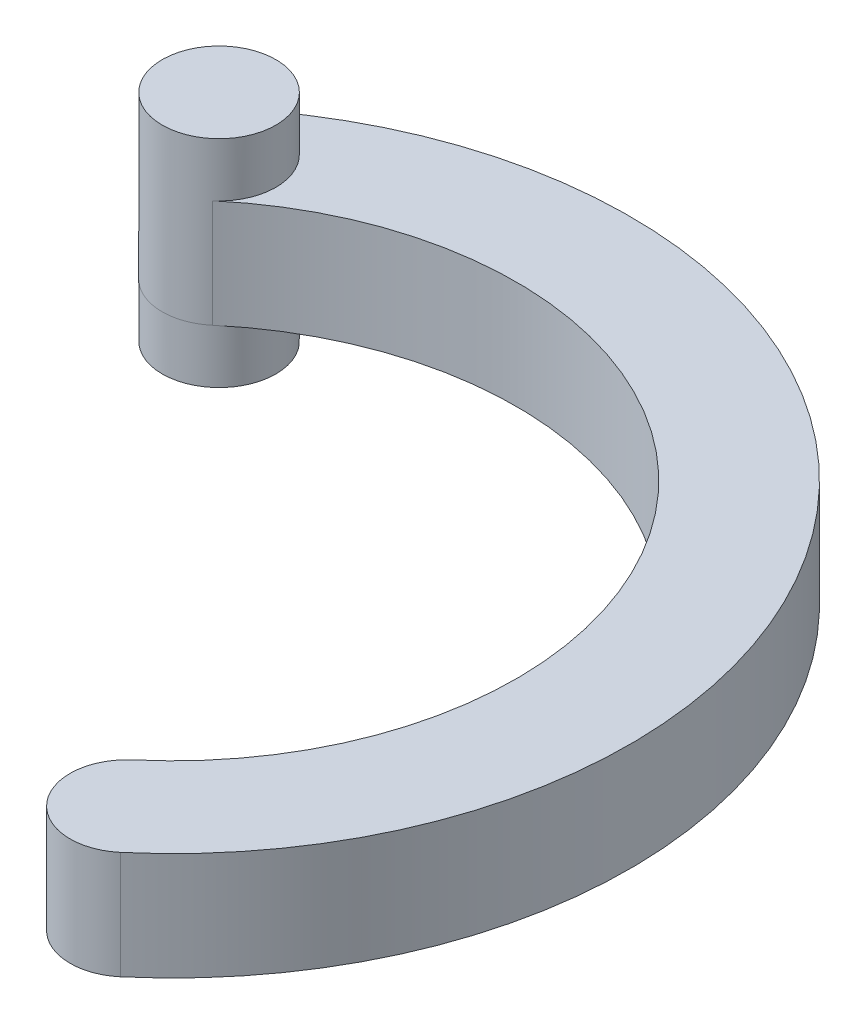
ISO-10303-21;
HEADER;
FILE_DESCRIPTION(('STEP AP214'),'2;1');
FILE_NAME('part.step','',(''),(''),'','','');
FILE_SCHEMA(('AUTOMOTIVE_DESIGN { 1 0 10303 214 1 1 1 1 }'));
ENDSEC;
DATA;
#1=APPLICATION_CONTEXT('core data for automotive mechanical design processes');
#2=APPLICATION_PROTOCOL_DEFINITION('international standard','automotive_design',2000,#1);
#3=PRODUCT_CONTEXT('',#1,'mechanical');
#4=PRODUCT('Part','Part','',(#3));
#5=PRODUCT_RELATED_PRODUCT_CATEGORY('part','',(#4));
#6=PRODUCT_DEFINITION_FORMATION('','',#4);
#7=PRODUCT_DEFINITION_CONTEXT('part definition',#1,'design');
#8=PRODUCT_DEFINITION('design','',#6,#7);
#9=PRODUCT_DEFINITION_SHAPE('','',#8);
#10=(LENGTH_UNIT() NAMED_UNIT(*) SI_UNIT(.MILLI.,.METRE.));
#11=(NAMED_UNIT(*) PLANE_ANGLE_UNIT() SI_UNIT($,.RADIAN.));
#12=(NAMED_UNIT(*) SI_UNIT($,.STERADIAN.) SOLID_ANGLE_UNIT());
#13=UNCERTAINTY_MEASURE_WITH_UNIT(LENGTH_MEASURE(1.E-05),#10,'distance_accuracy_value','');
#14=(GEOMETRIC_REPRESENTATION_CONTEXT(3) GLOBAL_UNCERTAINTY_ASSIGNED_CONTEXT((#13)) GLOBAL_UNIT_ASSIGNED_CONTEXT((#10,
#11,#12)) REPRESENTATION_CONTEXT('',''));
#15=CARTESIAN_POINT('',(0.,0.,0.));
#16=DIRECTION('',(0.,0.,1.));
#17=DIRECTION('',(1.,0.,0.));
#18=AXIS2_PLACEMENT_3D('',#15,#16,#17);
#19=CARTESIAN_POINT('',(48.0814758361402,10.,56.6320475670309));
#20=DIRECTION('',(0.,-1.,0.));
#21=DIRECTION('',(0.,0.,-1.));
#22=AXIS2_PLACEMENT_3D('',#19,#20,#21);
#23=CYLINDRICAL_SURFACE('',#22,5.27141553759391);
#24=CARTESIAN_POINT('',(48.0814758361402,0.,56.6320475670309));
#25=DIRECTION('',(0.,1.,0.));
#26=DIRECTION('',(0.,0.,1.));
#27=AXIS2_PLACEMENT_3D('',#24,#25,#26);
#28=CIRCLE('',#27,5.27141553759391);
#29=CARTESIAN_POINT('',(44.6697496335499,0.,52.6135968595386));
#30=VERTEX_POINT('',#29);
#31=CARTESIAN_POINT('',(51.4932020387305,0.,60.6504982745232));
#32=VERTEX_POINT('',#31);
#33=EDGE_CURVE('E113',#30,#32,#28,.T.);
#34=ORIENTED_EDGE('',*,*,#33,.T.);
#35=DIRECTION('',(0.,-1.,0.));
#36=VECTOR('',#35,1.);
#37=CARTESIAN_POINT('',(51.4932020387305,10.,60.6504982745232));
#38=LINE('',#37,#36);
#39=CARTESIAN_POINT('',(51.4932020387305,10.,60.6504982745232));
#40=VERTEX_POINT('',#39);
#41=EDGE_CURVE('E52',#40,#32,#38,.T.);
#42=ORIENTED_EDGE('',*,*,#41,.F.);
#43=CARTESIAN_POINT('',(48.0814758361402,10.,56.6320475670309));
#44=DIRECTION('',(0.,1.,0.));
#45=DIRECTION('',(0.,0.,1.));
#46=AXIS2_PLACEMENT_3D('',#43,#44,#45);
#47=CIRCLE('',#46,5.27141553759391);
#48=CARTESIAN_POINT('',(44.6697496335499,10.,52.6135968595386));
#49=VERTEX_POINT('',#48);
#50=EDGE_CURVE('E118',#49,#40,#47,.T.);
#51=ORIENTED_EDGE('',*,*,#50,.F.);
#52=DIRECTION('',(0.,-1.,0.));
#53=VECTOR('',#52,1.);
#54=CARTESIAN_POINT('',(44.6697496335499,10.,52.6135968595386));
#55=LINE('',#54,#53);
#56=EDGE_CURVE('E94',#49,#30,#55,.T.);
#57=ORIENTED_EDGE('',*,*,#56,.T.);
#58=EDGE_LOOP('',(#34,#42,#51,#57));
#59=FACE_BOUND('',#58,.T.);
#60=ADVANCED_FACE('F43',(#59),#23,.T.);
#61=CARTESIAN_POINT('',(24.0407379180869,10.,28.3160237835012));
#62=DIRECTION('',(0.,-1.,0.));
#63=DIRECTION('',(0.,0.,-1.));
#64=AXIS2_PLACEMENT_3D('',#61,#62,#63);
#65=CYLINDRICAL_SURFACE('',#64,42.416459386726);
#66=CARTESIAN_POINT('',(24.0407379180869,0.,28.3160237835012));
#67=DIRECTION('',(0.,1.,0.));
#68=DIRECTION('',(0.,0.,1.));
#69=AXIS2_PLACEMENT_3D('',#66,#67,#68);
#70=CIRCLE('',#69,42.416459386726);
#71=CARTESIAN_POINT('',(-3.41172620259505,0.,-4.01845070748825));
#72=VERTEX_POINT('',#71);
#73=EDGE_CURVE('E126',#32,#72,#70,.T.);
#74=ORIENTED_EDGE('',*,*,#73,.T.);
#75=DIRECTION('',(0.,-1.,0.));
#76=VECTOR('',#75,1.);
#77=CARTESIAN_POINT('',(-3.41172620259505,10.,-4.01845070748825));
#78=LINE('',#77,#76);
#79=CARTESIAN_POINT('',(-3.41172620259505,10.,-4.01845070748825));
#80=VERTEX_POINT('',#79);
#81=EDGE_CURVE('E103',#80,#72,#78,.T.);
#82=ORIENTED_EDGE('',*,*,#81,.F.);
#83=CARTESIAN_POINT('',(24.0407379180869,10.,28.3160237835012));
#84=DIRECTION('',(0.,1.,0.));
#85=DIRECTION('',(0.,0.,1.));
#86=AXIS2_PLACEMENT_3D('',#83,#84,#85);
#87=CIRCLE('',#86,42.416459386726);
#88=EDGE_CURVE('E90',#40,#80,#87,.T.);
#89=ORIENTED_EDGE('',*,*,#88,.F.);
#90=ORIENTED_EDGE('',*,*,#41,.T.);
#91=EDGE_LOOP('',(#74,#82,#89,#90));
#92=FACE_BOUND('',#91,.T.);
#93=ADVANCED_FACE('F138',(#92),#65,.T.);
#94=CARTESIAN_POINT('',(0.,10.,0.));
#95=DIRECTION('',(0.,-1.,0.));
#96=DIRECTION('',(0.,0.,-1.));
#97=AXIS2_PLACEMENT_3D('',#94,#95,#96);
#98=CYLINDRICAL_SURFACE('',#97,5.27141553759391);
#99=CARTESIAN_POINT('',(0.,0.,0.));
#100=DIRECTION('',(0.,1.,0.));
#101=DIRECTION('',(0.,0.,1.));
#102=AXIS2_PLACEMENT_3D('',#99,#100,#101);
#103=CIRCLE('',#102,5.27141553759391);
#104=CARTESIAN_POINT('',(3.41172620259506,0.,4.01845070748825));
#105=VERTEX_POINT('',#104);
#106=EDGE_CURVE('E79',#72,#105,#103,.T.);
#107=ORIENTED_EDGE('',*,*,#106,.T.);
#108=DIRECTION('',(0.,-1.,0.));
#109=VECTOR('',#108,1.);
#110=CARTESIAN_POINT('',(3.41172620259506,10.,4.01845070748825));
#111=LINE('',#110,#109);
#112=CARTESIAN_POINT('',(3.41172620259505,10.,4.01845070748825));
#113=VERTEX_POINT('',#112);
#114=EDGE_CURVE('E93',#113,#105,#111,.T.);
#115=ORIENTED_EDGE('',*,*,#114,.F.);
#116=CARTESIAN_POINT('',(0.,10.,0.));
#117=DIRECTION('',(0.,1.,0.));
#118=DIRECTION('',(0.,0.,1.));
#119=AXIS2_PLACEMENT_3D('',#116,#117,#118);
#120=CIRCLE('',#119,5.27141553759391);
#121=EDGE_CURVE('E101',#113,#80,#120,.T.);
#122=ORIENTED_EDGE('',*,*,#121,.T.);
#123=ORIENTED_EDGE('',*,*,#81,.T.);
#124=EDGE_LOOP('',(#107,#115,#122,#123));
#125=FACE_BOUND('',#124,.T.);
#126=CARTESIAN_POINT('',(0.,15.,0.));
#127=DIRECTION('',(0.,1.,0.));
#128=DIRECTION('',(0.,0.,1.));
#129=AXIS2_PLACEMENT_3D('',#126,#127,#128);
#130=CIRCLE('',#129,5.27141553759391);
#131=CARTESIAN_POINT('',(0.,15.,5.27141553759391));
#132=VERTEX_POINT('',#131);
#133=EDGE_CURVE('E107',#132,#132,#130,.T.);
#134=ORIENTED_EDGE('',*,*,#133,.F.);
#135=EDGE_LOOP('',(#134));
#136=FACE_BOUND('',#135,.T.);
#137=ADVANCED_FACE('F99',(#125,#136),#98,.T.);
#138=CARTESIAN_POINT('',(24.0407379180869,10.,28.3160237835012));
#139=DIRECTION('',(0.,-1.,0.));
#140=DIRECTION('',(0.,0.,-1.));
#141=AXIS2_PLACEMENT_3D('',#138,#139,#140);
#142=CYLINDRICAL_SURFACE('',#141,31.8736283115382);
#143=CARTESIAN_POINT('',(24.0407379180869,0.,28.3160237835012));
#144=DIRECTION('',(0.,-1.,0.));
#145=DIRECTION('',(0.,0.,1.));
#146=AXIS2_PLACEMENT_3D('',#143,#144,#145);
#147=CIRCLE('',#146,31.8736283115382);
#148=EDGE_CURVE('E84',#105,#30,#147,.T.);
#149=ORIENTED_EDGE('',*,*,#148,.T.);
#150=ORIENTED_EDGE('',*,*,#56,.F.);
#151=CARTESIAN_POINT('',(24.0407379180869,10.,28.3160237835012));
#152=DIRECTION('',(0.,-1.,0.));
#153=DIRECTION('',(0.,0.,1.));
#154=AXIS2_PLACEMENT_3D('',#151,#152,#153);
#155=CIRCLE('',#154,31.8736283115382);
#156=EDGE_CURVE('E60',#113,#49,#155,.T.);
#157=ORIENTED_EDGE('',*,*,#156,.F.);
#158=ORIENTED_EDGE('',*,*,#114,.T.);
#159=EDGE_LOOP('',(#149,#150,#157,#158));
#160=FACE_BOUND('',#159,.T.);
#161=ADVANCED_FACE('F92',(#160),#142,.F.);
#162=CARTESIAN_POINT('',(36.0611068771135,10.,42.4740356752661));
#163=DIRECTION('',(0.,1.,0.));
#164=DIRECTION('',(0.,0.,1.));
#165=AXIS2_PLACEMENT_3D('',#162,#163,#164);
#166=PLANE('',#165);
#167=ORIENTED_EDGE('',*,*,#121,.F.);
#168=ORIENTED_EDGE('',*,*,#156,.T.);
#169=ORIENTED_EDGE('',*,*,#50,.T.);
#170=ORIENTED_EDGE('',*,*,#88,.T.);
#171=EDGE_LOOP('',(#167,#168,#169,#170));
#172=FACE_BOUND('',#171,.T.);
#173=ADVANCED_FACE('F105',(#172),#166,.T.);
#174=CARTESIAN_POINT('',(36.0611068771135,0.,42.4740356752661));
#175=DIRECTION('',(0.,1.,0.));
#176=DIRECTION('',(0.,0.,1.));
#177=AXIS2_PLACEMENT_3D('',#174,#175,#176);
#178=PLANE('',#177);
#179=CARTESIAN_POINT('',(0.,0.,0.));
#180=DIRECTION('',(0.,1.,0.));
#181=DIRECTION('',(0.,0.,1.));
#182=AXIS2_PLACEMENT_3D('',#179,#180,#181);
#183=CIRCLE('',#182,5.27);
#184=CARTESIAN_POINT('',(0.,0.,5.27));
#185=VERTEX_POINT('',#184);
#186=EDGE_CURVE('E11',#185,#185,#183,.F.);
#187=ORIENTED_EDGE('',*,*,#186,.F.);
#188=EDGE_LOOP('',(#187));
#189=FACE_BOUND('',#188,.T.);
#190=ORIENTED_EDGE('',*,*,#33,.F.);
#191=ORIENTED_EDGE('',*,*,#148,.F.);
#192=ORIENTED_EDGE('',*,*,#106,.F.);
#193=ORIENTED_EDGE('',*,*,#73,.F.);
#194=EDGE_LOOP('',(#190,#191,#192,#193));
#195=FACE_BOUND('',#194,.T.);
#196=ADVANCED_FACE('F142',(#189,#195),#178,.F.);
#197=CARTESIAN_POINT('',(0.,15.,0.));
#198=DIRECTION('',(0.,1.,0.));
#199=DIRECTION('',(0.,0.,1.));
#200=AXIS2_PLACEMENT_3D('',#197,#198,#199);
#201=PLANE('',#200);
#202=ORIENTED_EDGE('',*,*,#133,.T.);
#203=EDGE_LOOP('',(#202));
#204=FACE_BOUND('',#203,.T.);
#205=ADVANCED_FACE('F144',(#204),#201,.T.);
#206=CARTESIAN_POINT('',(0.,-5.,0.));
#207=DIRECTION('',(0.,1.,0.));
#208=DIRECTION('',(0.,0.,1.));
#209=AXIS2_PLACEMENT_3D('',#206,#207,#208);
#210=CYLINDRICAL_SURFACE('',#209,5.27);
#211=CARTESIAN_POINT('',(0.,-5.,0.));
#212=DIRECTION('',(0.,-1.,0.));
#213=DIRECTION('',(0.,0.,-1.));
#214=AXIS2_PLACEMENT_3D('',#211,#212,#213);
#215=CIRCLE('',#214,5.27);
#216=CARTESIAN_POINT('',(0.,-5.,-5.27));
#217=VERTEX_POINT('',#216);
#218=EDGE_CURVE('E108',#217,#217,#215,.T.);
#219=ORIENTED_EDGE('',*,*,#218,.F.);
#220=EDGE_LOOP('',(#219));
#221=FACE_BOUND('',#220,.T.);
#222=ORIENTED_EDGE('',*,*,#186,.T.);
#223=EDGE_LOOP('',(#222));
#224=FACE_BOUND('',#223,.T.);
#225=ADVANCED_FACE('F151',(#221,#224),#210,.T.);
#226=CARTESIAN_POINT('',(0.,-5.,0.));
#227=DIRECTION('',(0.,-1.,0.));
#228=DIRECTION('',(0.,0.,-1.));
#229=AXIS2_PLACEMENT_3D('',#226,#227,#228);
#230=PLANE('',#229);
#231=ORIENTED_EDGE('',*,*,#218,.T.);
#232=EDGE_LOOP('',(#231));
#233=FACE_BOUND('',#232,.T.);
#234=ADVANCED_FACE('F198',(#233),#230,.T.);
#235=CLOSED_SHELL('',(#60,#93,#137,#161,#173,#196,#205,#225,#234));
#236=MANIFOLD_SOLID_BREP('B2',#235);
#237=ADVANCED_BREP_SHAPE_REPRESENTATION('',(#18,#236),#14);
#238=SHAPE_DEFINITION_REPRESENTATION(#9,#237);
ENDSEC;
END-ISO-10303-21;
